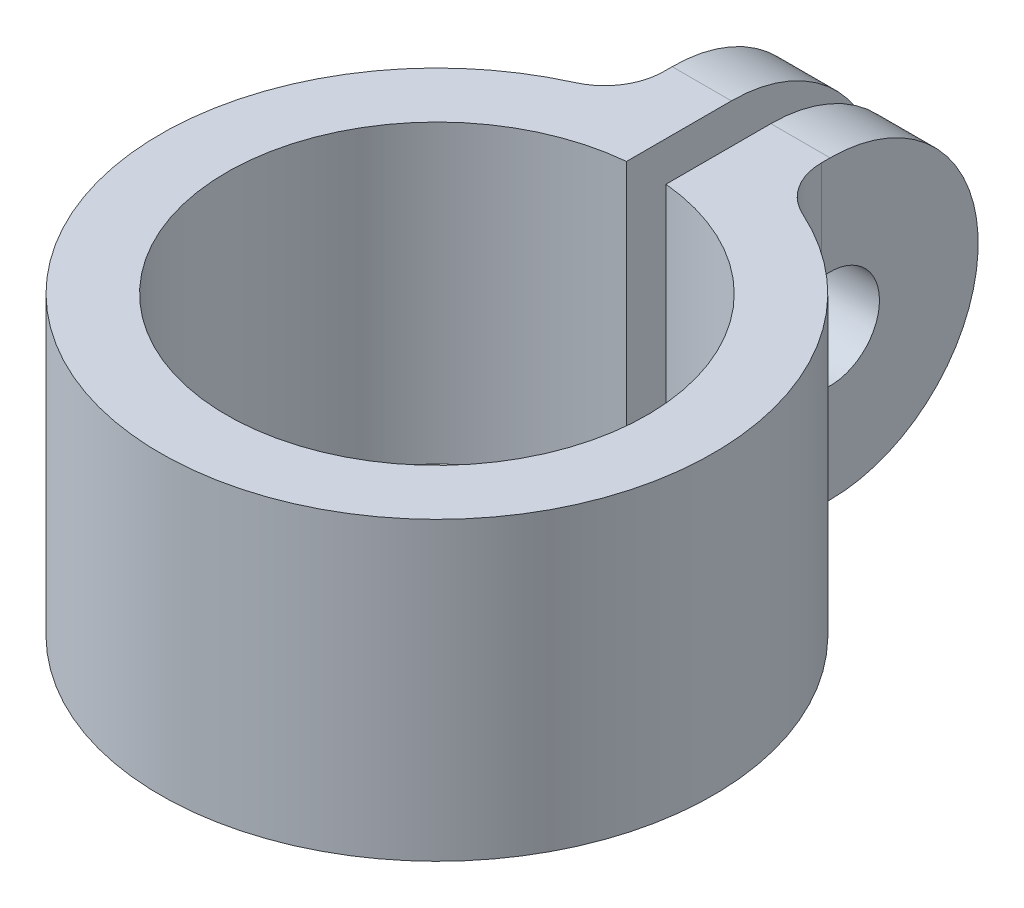
ISO-10303-21;
HEADER;
FILE_DESCRIPTION(('STEP AP214'),'2;1');
FILE_NAME('part.step','',(''),(''),'','','');
FILE_SCHEMA(('AUTOMOTIVE_DESIGN { 1 0 10303 214 1 1 1 1 }'));
ENDSEC;
DATA;
#1=APPLICATION_CONTEXT('core data for automotive mechanical design processes');
#2=APPLICATION_PROTOCOL_DEFINITION('international standard','automotive_design',2000,#1);
#3=PRODUCT_CONTEXT('',#1,'mechanical');
#4=PRODUCT('Part','Part','',(#3));
#5=PRODUCT_RELATED_PRODUCT_CATEGORY('part','',(#4));
#6=PRODUCT_DEFINITION_FORMATION('','',#4);
#7=PRODUCT_DEFINITION_CONTEXT('part definition',#1,'design');
#8=PRODUCT_DEFINITION('design','',#6,#7);
#9=PRODUCT_DEFINITION_SHAPE('','',#8);
#10=(LENGTH_UNIT() NAMED_UNIT(*) SI_UNIT(.MILLI.,.METRE.));
#11=(NAMED_UNIT(*) PLANE_ANGLE_UNIT() SI_UNIT($,.RADIAN.));
#12=(NAMED_UNIT(*) SI_UNIT($,.STERADIAN.) SOLID_ANGLE_UNIT());
#13=UNCERTAINTY_MEASURE_WITH_UNIT(LENGTH_MEASURE(1.E-05),#10,'distance_accuracy_value','');
#14=(GEOMETRIC_REPRESENTATION_CONTEXT(3) GLOBAL_UNCERTAINTY_ASSIGNED_CONTEXT((#13)) GLOBAL_UNIT_ASSIGNED_CONTEXT((#10,
#11,#12)) REPRESENTATION_CONTEXT('',''));
#15=CARTESIAN_POINT('',(0.,0.,0.));
#16=DIRECTION('',(0.,0.,1.));
#17=DIRECTION('',(1.,0.,0.));
#18=AXIS2_PLACEMENT_3D('',#15,#16,#17);
#19=CARTESIAN_POINT('',(4.,7.5,-15.9164078649987));
#20=DIRECTION('',(-1.,0.,0.));
#21=DIRECTION('',(0.,0.,1.));
#22=AXIS2_PLACEMENT_3D('',#19,#20,#21);
#23=CYLINDRICAL_SURFACE('',#22,7.5);
#24=DIRECTION('',(1.,0.,0.));
#25=VECTOR('',#24,1.);
#26=CARTESIAN_POINT('',(4.,15.,-15.9164078649987));
#27=LINE('',#26,#25);
#28=CARTESIAN_POINT('',(4.,15.,-15.9164078649987));
#29=VERTEX_POINT('',#28);
#30=CARTESIAN_POINT('',(0.999999999999997,15.,-15.9164078649987));
#31=VERTEX_POINT('',#30);
#32=EDGE_CURVE('E302',#29,#31,#27,.F.);
#33=ORIENTED_EDGE('',*,*,#32,.F.);
#34=CARTESIAN_POINT('',(4.,7.5,-15.9164078649987));
#35=DIRECTION('',(-1.,0.,0.));
#36=DIRECTION('',(0.,0.,1.));
#37=AXIS2_PLACEMENT_3D('',#34,#35,#36);
#38=CIRCLE('',#37,7.5);
#39=CARTESIAN_POINT('',(4.,0.,-15.9164078649987));
#40=VERTEX_POINT('',#39);
#41=EDGE_CURVE('E52',#40,#29,#38,.F.);
#42=ORIENTED_EDGE('',*,*,#41,.F.);
#43=DIRECTION('',(-1.,0.,0.));
#44=VECTOR('',#43,1.);
#45=CARTESIAN_POINT('',(7.,0.,-15.9164078649987));
#46=LINE('',#45,#44);
#47=CARTESIAN_POINT('',(0.999999999999997,0.,-15.9164078649987));
#48=VERTEX_POINT('',#47);
#49=EDGE_CURVE('E306',#48,#40,#46,.F.);
#50=ORIENTED_EDGE('',*,*,#49,.F.);
#51=CARTESIAN_POINT('',(0.999999999999997,7.5,-15.9164078649987));
#52=DIRECTION('',(1.,0.,0.));
#53=DIRECTION('',(0.,0.,-1.));
#54=AXIS2_PLACEMENT_3D('',#51,#52,#53);
#55=CIRCLE('',#54,7.5);
#56=EDGE_CURVE('E11',#31,#48,#55,.F.);
#57=ORIENTED_EDGE('',*,*,#56,.F.);
#58=EDGE_LOOP('',(#33,#42,#50,#57));
#59=FACE_BOUND('',#58,.T.);
#60=ADVANCED_FACE('F43',(#59),#23,.T.);
#61=CARTESIAN_POINT('',(1.99999999999999,7.5,-15.9164078649987));
#62=DIRECTION('',(-1.,0.,0.));
#63=DIRECTION('',(0.,0.,1.));
#64=AXIS2_PLACEMENT_3D('',#61,#62,#63);
#65=CYLINDRICAL_SURFACE('',#64,7.5);
#66=DIRECTION('',(1.,0.,0.));
#67=VECTOR('',#66,1.);
#68=CARTESIAN_POINT('',(1.99999999999999,15.,-15.9164078649987));
#69=LINE('',#68,#67);
#70=CARTESIAN_POINT('',(-1.,15.,-15.9164078649987));
#71=VERTEX_POINT('',#70);
#72=CARTESIAN_POINT('',(-4.,15.,-15.9164078649987));
#73=VERTEX_POINT('',#72);
#74=EDGE_CURVE('E264',#71,#73,#69,.F.);
#75=ORIENTED_EDGE('',*,*,#74,.F.);
#76=CARTESIAN_POINT('',(-1.,7.5,-15.9164078649987));
#77=DIRECTION('',(-1.,0.,0.));
#78=DIRECTION('',(0.,0.,1.));
#79=AXIS2_PLACEMENT_3D('',#76,#77,#78);
#80=CIRCLE('',#79,7.5);
#81=CARTESIAN_POINT('',(-1.,0.,-15.9164078649987));
#82=VERTEX_POINT('',#81);
#83=EDGE_CURVE('E296',#82,#71,#80,.F.);
#84=ORIENTED_EDGE('',*,*,#83,.F.);
#85=DIRECTION('',(-1.,0.,0.));
#86=VECTOR('',#85,1.);
#87=CARTESIAN_POINT('',(7.,0.,-15.9164078649987));
#88=LINE('',#87,#86);
#89=CARTESIAN_POINT('',(-4.,0.,-15.9164078649987));
#90=VERTEX_POINT('',#89);
#91=EDGE_CURVE('E268',#90,#82,#88,.F.);
#92=ORIENTED_EDGE('',*,*,#91,.F.);
#93=CARTESIAN_POINT('',(-4.,7.5,-15.9164078649987));
#94=DIRECTION('',(1.,0.,0.));
#95=DIRECTION('',(0.,0.,-1.));
#96=AXIS2_PLACEMENT_3D('',#93,#94,#95);
#97=CIRCLE('',#96,7.5);
#98=EDGE_CURVE('E312',#73,#90,#97,.F.);
#99=ORIENTED_EDGE('',*,*,#98,.F.);
#100=EDGE_LOOP('',(#75,#84,#92,#99));
#101=FACE_BOUND('',#100,.T.);
#102=ADVANCED_FACE('F327',(#101),#65,.T.);
#103=CARTESIAN_POINT('',(7.,15.,-15.4919333848297));
#104=DIRECTION('',(0.,-1.,0.));
#105=DIRECTION('',(0.,0.,-1.));
#106=AXIS2_PLACEMENT_3D('',#103,#104,#105);
#107=CYLINDRICAL_SURFACE('',#106,3.);
#108=CARTESIAN_POINT('',(7.,0.,-15.4919333848297));
#109=DIRECTION('',(0.,-1.,0.));
#110=DIRECTION('',(0.,0.,1.));
#111=AXIS2_PLACEMENT_3D('',#108,#109,#110);
#112=CIRCLE('',#111,3.);
#113=CARTESIAN_POINT('',(5.76470588235293,0.,-12.7580627875068));
#114=VERTEX_POINT('',#113);
#115=CARTESIAN_POINT('',(4.,0.,-15.4919333848297));
#116=VERTEX_POINT('',#115);
#117=EDGE_CURVE('E204',#114,#116,#112,.T.);
#118=ORIENTED_EDGE('',*,*,#117,.T.);
#119=DIRECTION('',(0.,-1.,0.));
#120=VECTOR('',#119,1.);
#121=CARTESIAN_POINT('',(4.,15.,-15.4919333848297));
#122=LINE('',#121,#120);
#123=CARTESIAN_POINT('',(4.,5.03629924388428,-15.4919333848297));
#124=VERTEX_POINT('',#123);
#125=EDGE_CURVE('E259',#124,#116,#122,.T.);
#126=ORIENTED_EDGE('',*,*,#125,.F.);
#127=CARTESIAN_POINT('',(4.,9.96370075611572,-15.4919333848297));
#128=VERTEX_POINT('',#127);
#129=EDGE_CURVE('E253',#128,#124,#122,.T.);
#130=ORIENTED_EDGE('',*,*,#129,.F.);
#131=CARTESIAN_POINT('',(4.,15.,-15.4919333848297));
#132=VERTEX_POINT('',#131);
#133=EDGE_CURVE('E258',#132,#128,#122,.T.);
#134=ORIENTED_EDGE('',*,*,#133,.F.);
#135=CARTESIAN_POINT('',(7.,15.,-15.4919333848297));
#136=DIRECTION('',(0.,-1.,0.));
#137=DIRECTION('',(0.,0.,1.));
#138=AXIS2_PLACEMENT_3D('',#135,#136,#137);
#139=CIRCLE('',#138,3.);
#140=CARTESIAN_POINT('',(5.76470588235293,15.,-12.7580627875068));
#141=VERTEX_POINT('',#140);
#142=EDGE_CURVE('E183',#141,#132,#139,.T.);
#143=ORIENTED_EDGE('',*,*,#142,.F.);
#144=DIRECTION('',(0.,-1.,0.));
#145=VECTOR('',#144,1.);
#146=CARTESIAN_POINT('',(5.76470588235293,15.,-12.7580627875068));
#147=LINE('',#146,#145);
#148=EDGE_CURVE('E170',#141,#114,#147,.T.);
#149=ORIENTED_EDGE('',*,*,#148,.T.);
#150=EDGE_LOOP('',(#118,#126,#130,#134,#143,#149));
#151=FACE_BOUND('',#150,.T.);
#152=ADVANCED_FACE('F256',(#151),#107,.F.);
#153=CARTESIAN_POINT('',(4.,15.,-23.4164078649987));
#154=DIRECTION('',(-1.,0.,0.));
#155=DIRECTION('',(0.,0.,1.));
#156=AXIS2_PLACEMENT_3D('',#153,#154,#155);
#157=PLANE('',#156);
#158=ORIENTED_EDGE('',*,*,#133,.T.);
#159=CARTESIAN_POINT('',(4.,7.5,-15.9164078649987));
#160=DIRECTION('',(1.,0.,0.));
#161=DIRECTION('',(0.,0.,-1.));
#162=AXIS2_PLACEMENT_3D('',#159,#160,#161);
#163=CIRCLE('',#162,2.5);
#164=EDGE_CURVE('E240',#124,#128,#163,.T.);
#165=ORIENTED_EDGE('',*,*,#164,.F.);
#166=ORIENTED_EDGE('',*,*,#125,.T.);
#167=DIRECTION('',(0.,0.,-1.));
#168=VECTOR('',#167,1.);
#169=CARTESIAN_POINT('',(4.,0.,-23.4164078649987));
#170=LINE('',#169,#168);
#171=EDGE_CURVE('E200',#116,#40,#170,.T.);
#172=ORIENTED_EDGE('',*,*,#171,.T.);
#173=ORIENTED_EDGE('',*,*,#41,.T.);
#174=DIRECTION('',(0.,0.,-1.));
#175=VECTOR('',#174,1.);
#176=CARTESIAN_POINT('',(4.,15.,-23.4164078649987));
#177=LINE('',#176,#175);
#178=EDGE_CURVE('E226',#132,#29,#177,.T.);
#179=ORIENTED_EDGE('',*,*,#178,.F.);
#180=EDGE_LOOP('',(#158,#165,#166,#172,#173,#179));
#181=FACE_BOUND('',#180,.T.);
#182=ADVANCED_FACE('F262',(#181),#157,.F.);
#183=CARTESIAN_POINT('',(0.999999999999997,15.,-10.6029477033512));
#184=DIRECTION('',(1.,0.,0.));
#185=DIRECTION('',(0.,0.,-1.));
#186=AXIS2_PLACEMENT_3D('',#183,#184,#185);
#187=PLANE('',#186);
#188=CARTESIAN_POINT('',(0.999999999999997,7.5,-15.9164078649987));
#189=DIRECTION('',(1.,0.,0.));
#190=DIRECTION('',(0.,0.,-1.));
#191=AXIS2_PLACEMENT_3D('',#188,#189,#190);
#192=CIRCLE('',#191,2.5);
#193=CARTESIAN_POINT('',(0.999999999999997,7.5,-18.4164078649987));
#194=VERTEX_POINT('',#193);
#195=EDGE_CURVE('E208',#194,#194,#192,.T.);
#196=ORIENTED_EDGE('',*,*,#195,.T.);
#197=EDGE_LOOP('',(#196));
#198=FACE_BOUND('',#197,.T.);
#199=DIRECTION('',(0.,0.,1.));
#200=VECTOR('',#199,1.);
#201=CARTESIAN_POINT('',(0.999999999999997,15.,-10.6029477033512));
#202=LINE('',#201,#200);
#203=CARTESIAN_POINT('',(0.999999999999997,15.,-10.6029477033512));
#204=VERTEX_POINT('',#203);
#205=EDGE_CURVE('E223',#31,#204,#202,.T.);
#206=ORIENTED_EDGE('',*,*,#205,.F.);
#207=ORIENTED_EDGE('',*,*,#56,.T.);
#208=DIRECTION('',(0.,0.,1.));
#209=VECTOR('',#208,1.);
#210=CARTESIAN_POINT('',(0.999999999999997,0.,-10.6029477033512));
#211=LINE('',#210,#209);
#212=CARTESIAN_POINT('',(0.999999999999997,0.,-10.6029477033512));
#213=VERTEX_POINT('',#212);
#214=EDGE_CURVE('E197',#48,#213,#211,.T.);
#215=ORIENTED_EDGE('',*,*,#214,.T.);
#216=DIRECTION('',(0.,-1.,0.));
#217=VECTOR('',#216,1.);
#218=CARTESIAN_POINT('',(0.999999999999997,15.,-10.6029477033512));
#219=LINE('',#218,#217);
#220=EDGE_CURVE('E162',#204,#213,#219,.T.);
#221=ORIENTED_EDGE('',*,*,#220,.F.);
#222=EDGE_LOOP('',(#206,#207,#215,#221));
#223=FACE_BOUND('',#222,.T.);
#224=ADVANCED_FACE('F303',(#198,#223),#187,.F.);
#225=CARTESIAN_POINT('',(0.,15.,0.));
#226=DIRECTION('',(0.,-1.,0.));
#227=DIRECTION('',(0.,0.,-1.));
#228=AXIS2_PLACEMENT_3D('',#225,#226,#227);
#229=CYLINDRICAL_SURFACE('',#228,10.65);
#230=CARTESIAN_POINT('',(0.,0.,0.));
#231=DIRECTION('',(0.,-1.,0.));
#232=DIRECTION('',(0.,0.,1.));
#233=AXIS2_PLACEMENT_3D('',#230,#231,#232);
#234=CIRCLE('',#233,10.65);
#235=CARTESIAN_POINT('',(-0.999999999999999,0.,-10.6029477033512));
#236=VERTEX_POINT('',#235);
#237=EDGE_CURVE('E194',#213,#236,#234,.T.);
#238=ORIENTED_EDGE('',*,*,#237,.T.);
#239=DIRECTION('',(0.,-1.,0.));
#240=VECTOR('',#239,1.);
#241=CARTESIAN_POINT('',(-0.999999999999999,15.,-10.6029477033512));
#242=LINE('',#241,#240);
#243=CARTESIAN_POINT('',(-0.999999999999999,15.,-10.6029477033512));
#244=VERTEX_POINT('',#243);
#245=EDGE_CURVE('E158',#244,#236,#242,.T.);
#246=ORIENTED_EDGE('',*,*,#245,.F.);
#247=CARTESIAN_POINT('',(0.,15.,0.));
#248=DIRECTION('',(0.,-1.,0.));
#249=DIRECTION('',(0.,0.,1.));
#250=AXIS2_PLACEMENT_3D('',#247,#248,#249);
#251=CIRCLE('',#250,10.65);
#252=EDGE_CURVE('E220',#204,#244,#251,.T.);
#253=ORIENTED_EDGE('',*,*,#252,.F.);
#254=ORIENTED_EDGE('',*,*,#220,.T.);
#255=EDGE_LOOP('',(#238,#246,#253,#254));
#256=FACE_BOUND('',#255,.T.);
#257=ADVANCED_FACE('F281',(#256),#229,.F.);
#258=CARTESIAN_POINT('',(-1.,15.,-10.6029477033512));
#259=DIRECTION('',(-1.,0.,0.));
#260=DIRECTION('',(0.,0.,1.));
#261=AXIS2_PLACEMENT_3D('',#258,#259,#260);
#262=PLANE('',#261);
#263=CARTESIAN_POINT('',(-1.,7.5,-15.9164078649987));
#264=DIRECTION('',(-1.,0.,0.));
#265=DIRECTION('',(0.,0.,1.));
#266=AXIS2_PLACEMENT_3D('',#263,#264,#265);
#267=CIRCLE('',#266,2.5);
#268=CARTESIAN_POINT('',(-1.,7.5,-13.4164078649987));
#269=VERTEX_POINT('',#268);
#270=EDGE_CURVE('E145',#269,#269,#267,.T.);
#271=ORIENTED_EDGE('',*,*,#270,.T.);
#272=EDGE_LOOP('',(#271));
#273=FACE_BOUND('',#272,.T.);
#274=DIRECTION('',(0.,0.,-1.));
#275=VECTOR('',#274,1.);
#276=CARTESIAN_POINT('',(-1.,0.,-10.6029477033512));
#277=LINE('',#276,#275);
#278=EDGE_CURVE('E190',#236,#82,#277,.T.);
#279=ORIENTED_EDGE('',*,*,#278,.T.);
#280=ORIENTED_EDGE('',*,*,#83,.T.);
#281=DIRECTION('',(0.,0.,-1.));
#282=VECTOR('',#281,1.);
#283=CARTESIAN_POINT('',(-1.,15.,-10.6029477033512));
#284=LINE('',#283,#282);
#285=EDGE_CURVE('E216',#244,#71,#284,.T.);
#286=ORIENTED_EDGE('',*,*,#285,.F.);
#287=ORIENTED_EDGE('',*,*,#245,.T.);
#288=EDGE_LOOP('',(#279,#280,#286,#287));
#289=FACE_BOUND('',#288,.T.);
#290=ADVANCED_FACE('F294',(#273,#289),#262,.F.);
#291=CARTESIAN_POINT('',(-4.,15.,-23.4164078649987));
#292=DIRECTION('',(1.,0.,0.));
#293=DIRECTION('',(0.,0.,-1.));
#294=AXIS2_PLACEMENT_3D('',#291,#292,#293);
#295=PLANE('',#294);
#296=DIRECTION('',(0.,-1.,0.));
#297=VECTOR('',#296,1.);
#298=CARTESIAN_POINT('',(-4.,15.,-15.4919333848297));
#299=LINE('',#298,#297);
#300=CARTESIAN_POINT('',(-4.,5.03629924388428,-15.4919333848297));
#301=VERTEX_POINT('',#300);
#302=CARTESIAN_POINT('',(-4.,0.,-15.4919333848297));
#303=VERTEX_POINT('',#302);
#304=EDGE_CURVE('E136',#301,#303,#299,.T.);
#305=ORIENTED_EDGE('',*,*,#304,.F.);
#306=CARTESIAN_POINT('',(-4.,7.5,-15.9164078649987));
#307=DIRECTION('',(1.,0.,0.));
#308=DIRECTION('',(0.,0.,-1.));
#309=AXIS2_PLACEMENT_3D('',#306,#307,#308);
#310=CIRCLE('',#309,2.5);
#311=CARTESIAN_POINT('',(-4.,9.96370075611572,-15.4919333848297));
#312=VERTEX_POINT('',#311);
#313=EDGE_CURVE('E142',#312,#301,#310,.F.);
#314=ORIENTED_EDGE('',*,*,#313,.F.);
#315=CARTESIAN_POINT('',(-4.,15.,-15.4919333848297));
#316=VERTEX_POINT('',#315);
#317=EDGE_CURVE('E135',#316,#312,#299,.T.);
#318=ORIENTED_EDGE('',*,*,#317,.F.);
#319=DIRECTION('',(0.,0.,1.));
#320=VECTOR('',#319,1.);
#321=CARTESIAN_POINT('',(-4.,15.,-23.4164078649987));
#322=LINE('',#321,#320);
#323=EDGE_CURVE('E213',#73,#316,#322,.T.);
#324=ORIENTED_EDGE('',*,*,#323,.F.);
#325=ORIENTED_EDGE('',*,*,#98,.T.);
#326=DIRECTION('',(0.,0.,1.));
#327=VECTOR('',#326,1.);
#328=CARTESIAN_POINT('',(-4.,0.,-23.4164078649987));
#329=LINE('',#328,#327);
#330=EDGE_CURVE('E187',#90,#303,#329,.T.);
#331=ORIENTED_EDGE('',*,*,#330,.T.);
#332=EDGE_LOOP('',(#305,#314,#318,#324,#325,#331));
#333=FACE_BOUND('',#332,.T.);
#334=ADVANCED_FACE('F149',(#333),#295,.F.);
#335=CARTESIAN_POINT('',(-7.,15.,-15.4919333848297));
#336=DIRECTION('',(0.,-1.,0.));
#337=DIRECTION('',(0.,0.,-1.));
#338=AXIS2_PLACEMENT_3D('',#335,#336,#337);
#339=CYLINDRICAL_SURFACE('',#338,3.);
#340=CARTESIAN_POINT('',(-7.,0.,-15.4919333848297));
#341=DIRECTION('',(0.,-1.,0.));
#342=DIRECTION('',(0.,0.,-1.));
#343=AXIS2_PLACEMENT_3D('',#340,#341,#342);
#344=CIRCLE('',#343,3.);
#345=CARTESIAN_POINT('',(-5.76470588235294,0.,-12.7580627875068));
#346=VERTEX_POINT('',#345);
#347=EDGE_CURVE('E184',#303,#346,#344,.T.);
#348=ORIENTED_EDGE('',*,*,#347,.T.);
#349=DIRECTION('',(0.,-1.,0.));
#350=VECTOR('',#349,1.);
#351=CARTESIAN_POINT('',(-5.76470588235294,15.,-12.7580627875068));
#352=LINE('',#351,#350);
#353=CARTESIAN_POINT('',(-5.76470588235294,15.,-12.7580627875068));
#354=VERTEX_POINT('',#353);
#355=EDGE_CURVE('E166',#354,#346,#352,.T.);
#356=ORIENTED_EDGE('',*,*,#355,.F.);
#357=CARTESIAN_POINT('',(-7.,15.,-15.4919333848297));
#358=DIRECTION('',(0.,-1.,0.));
#359=DIRECTION('',(0.,0.,-1.));
#360=AXIS2_PLACEMENT_3D('',#357,#358,#359);
#361=CIRCLE('',#360,3.);
#362=EDGE_CURVE('E156',#316,#354,#361,.T.);
#363=ORIENTED_EDGE('',*,*,#362,.F.);
#364=ORIENTED_EDGE('',*,*,#317,.T.);
#365=EDGE_CURVE('E130',#312,#301,#299,.T.);
#366=ORIENTED_EDGE('',*,*,#365,.T.);
#367=ORIENTED_EDGE('',*,*,#304,.T.);
#368=EDGE_LOOP('',(#348,#356,#363,#364,#366,#367));
#369=FACE_BOUND('',#368,.T.);
#370=ADVANCED_FACE('F154',(#369),#339,.F.);
#371=CARTESIAN_POINT('',(0.,15.,0.));
#372=DIRECTION('',(0.,-1.,0.));
#373=DIRECTION('',(0.,0.,-1.));
#374=AXIS2_PLACEMENT_3D('',#371,#372,#373);
#375=CYLINDRICAL_SURFACE('',#374,14.);
#376=CARTESIAN_POINT('',(0.,0.,0.));
#377=DIRECTION('',(0.,1.,0.));
#378=DIRECTION('',(0.,0.,1.));
#379=AXIS2_PLACEMENT_3D('',#376,#377,#378);
#380=CIRCLE('',#379,14.);
#381=EDGE_CURVE('E180',#346,#114,#380,.T.);
#382=ORIENTED_EDGE('',*,*,#381,.T.);
#383=ORIENTED_EDGE('',*,*,#148,.F.);
#384=CARTESIAN_POINT('',(0.,15.,0.));
#385=DIRECTION('',(0.,1.,0.));
#386=DIRECTION('',(0.,0.,1.));
#387=AXIS2_PLACEMENT_3D('',#384,#385,#386);
#388=CIRCLE('',#387,14.);
#389=EDGE_CURVE('E177',#354,#141,#388,.T.);
#390=ORIENTED_EDGE('',*,*,#389,.F.);
#391=ORIENTED_EDGE('',*,*,#355,.T.);
#392=EDGE_LOOP('',(#382,#383,#390,#391));
#393=FACE_BOUND('',#392,.T.);
#394=ADVANCED_FACE('F330',(#393),#375,.T.);
#395=CARTESIAN_POINT('',(7.,15.,-15.4919333848297));
#396=DIRECTION('',(0.,1.,0.));
#397=DIRECTION('',(0.,0.,1.));
#398=AXIS2_PLACEMENT_3D('',#395,#396,#397);
#399=PLANE('',#398);
#400=ORIENTED_EDGE('',*,*,#178,.T.);
#401=ORIENTED_EDGE('',*,*,#32,.T.);
#402=ORIENTED_EDGE('',*,*,#205,.T.);
#403=ORIENTED_EDGE('',*,*,#252,.T.);
#404=ORIENTED_EDGE('',*,*,#285,.T.);
#405=ORIENTED_EDGE('',*,*,#74,.T.);
#406=ORIENTED_EDGE('',*,*,#323,.T.);
#407=ORIENTED_EDGE('',*,*,#362,.T.);
#408=ORIENTED_EDGE('',*,*,#389,.T.);
#409=ORIENTED_EDGE('',*,*,#142,.T.);
#410=EDGE_LOOP('',(#400,#401,#402,#403,#404,#405,#406,#407,#408,#409));
#411=FACE_BOUND('',#410,.T.);
#412=ADVANCED_FACE('F299',(#411),#399,.T.);
#413=CARTESIAN_POINT('',(7.,0.,-15.4919333848297));
#414=DIRECTION('',(0.,1.,0.));
#415=DIRECTION('',(0.,0.,1.));
#416=AXIS2_PLACEMENT_3D('',#413,#414,#415);
#417=PLANE('',#416);
#418=ORIENTED_EDGE('',*,*,#214,.F.);
#419=ORIENTED_EDGE('',*,*,#49,.T.);
#420=ORIENTED_EDGE('',*,*,#171,.F.);
#421=ORIENTED_EDGE('',*,*,#117,.F.);
#422=ORIENTED_EDGE('',*,*,#381,.F.);
#423=ORIENTED_EDGE('',*,*,#347,.F.);
#424=ORIENTED_EDGE('',*,*,#330,.F.);
#425=ORIENTED_EDGE('',*,*,#91,.T.);
#426=ORIENTED_EDGE('',*,*,#278,.F.);
#427=ORIENTED_EDGE('',*,*,#237,.F.);
#428=EDGE_LOOP('',(#418,#419,#420,#421,#422,#423,#424,#425,#426,#427));
#429=FACE_BOUND('',#428,.T.);
#430=ADVANCED_FACE('F288',(#429),#417,.F.);
#431=CARTESIAN_POINT('',(-4.,15.,-23.4164078649987));
#432=DIRECTION('',(1.,0.,0.));
#433=DIRECTION('',(0.,0.,-1.));
#434=AXIS2_PLACEMENT_3D('',#431,#432,#433);
#435=PLANE('',#434);
#436=ORIENTED_EDGE('',*,*,#365,.F.);
#437=EDGE_CURVE('E65',#301,#312,#310,.F.);
#438=ORIENTED_EDGE('',*,*,#437,.F.);
#439=EDGE_LOOP('',(#436,#438));
#440=FACE_BOUND('',#439,.T.);
#441=ADVANCED_FACE('F131',(#440),#435,.T.);
#442=CARTESIAN_POINT('',(-11.0710678118655,7.5,-15.9164078649987));
#443=DIRECTION('',(1.,0.,0.));
#444=DIRECTION('',(0.,0.,-1.));
#445=AXIS2_PLACEMENT_3D('',#442,#443,#444);
#446=CYLINDRICAL_SURFACE('',#445,2.5);
#447=ORIENTED_EDGE('',*,*,#437,.T.);
#448=ORIENTED_EDGE('',*,*,#313,.T.);
#449=EDGE_LOOP('',(#447,#448));
#450=FACE_BOUND('',#449,.T.);
#451=ORIENTED_EDGE('',*,*,#270,.F.);
#452=EDGE_LOOP('',(#451));
#453=FACE_BOUND('',#452,.T.);
#454=ADVANCED_FACE('F140',(#450,#453),#446,.F.);
#455=CARTESIAN_POINT('',(4.,7.5,-15.9164078649987));
#456=DIRECTION('',(1.,0.,0.));
#457=DIRECTION('',(0.,0.,-1.));
#458=AXIS2_PLACEMENT_3D('',#455,#456,#457);
#459=PLANE('',#458);
#460=EDGE_CURVE('E58',#128,#124,#163,.T.);
#461=ORIENTED_EDGE('',*,*,#460,.F.);
#462=ORIENTED_EDGE('',*,*,#129,.T.);
#463=EDGE_LOOP('',(#461,#462));
#464=FACE_BOUND('',#463,.T.);
#465=ADVANCED_FACE('F252',(#464),#459,.F.);
#466=ORIENTED_EDGE('',*,*,#460,.T.);
#467=ORIENTED_EDGE('',*,*,#164,.T.);
#468=EDGE_LOOP('',(#466,#467));
#469=FACE_BOUND('',#468,.T.);
#470=ORIENTED_EDGE('',*,*,#195,.F.);
#471=EDGE_LOOP('',(#470));
#472=FACE_BOUND('',#471,.T.);
#473=ADVANCED_FACE('F245',(#469,#472),#446,.F.);
#474=CLOSED_SHELL('',(#60,#102,#152,#182,#224,#257,#290,#334,#370,#394,#412,#430,#441,#454,#465,#473));
#475=MANIFOLD_SOLID_BREP('B2',#474);
#476=ADVANCED_BREP_SHAPE_REPRESENTATION('',(#18,#475),#14);
#477=SHAPE_DEFINITION_REPRESENTATION(#9,#476);
ENDSEC;
END-ISO-10303-21;
